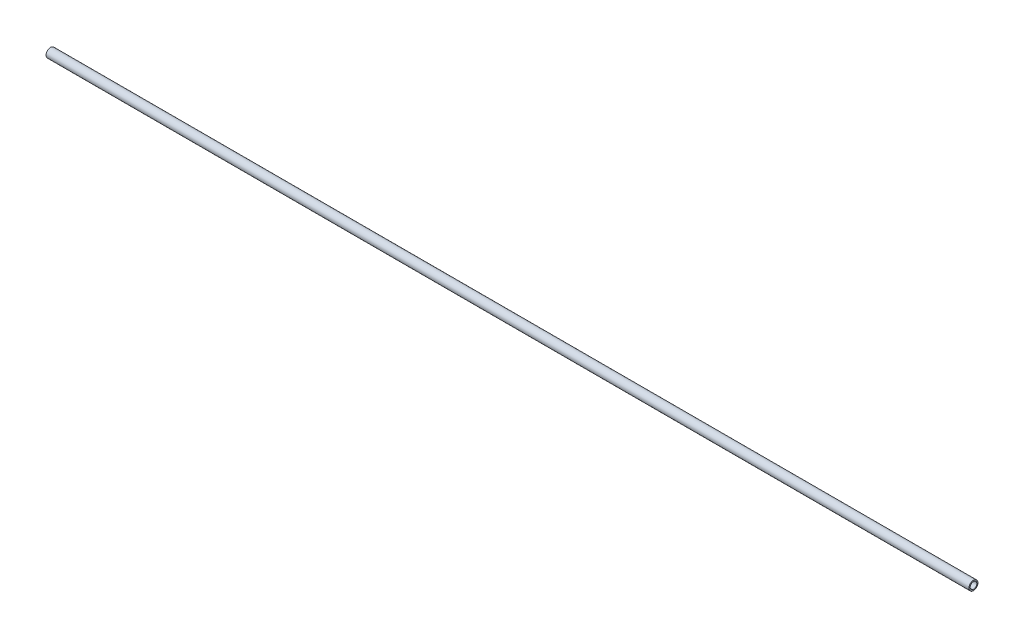
ISO-10303-21;
HEADER;
FILE_DESCRIPTION(('STEP AP214'),'2;1');
FILE_NAME('part.step','',(''),(''),'','','');
FILE_SCHEMA(('AUTOMOTIVE_DESIGN { 1 0 10303 214 1 1 1 1 }'));
ENDSEC;
DATA;
#1=APPLICATION_CONTEXT('core data for automotive mechanical design processes');
#2=APPLICATION_PROTOCOL_DEFINITION('international standard','automotive_design',2000,#1);
#3=PRODUCT_CONTEXT('',#1,'mechanical');
#4=PRODUCT('Part','Part','',(#3));
#5=PRODUCT_RELATED_PRODUCT_CATEGORY('part','',(#4));
#6=PRODUCT_DEFINITION_FORMATION('','',#4);
#7=PRODUCT_DEFINITION_CONTEXT('part definition',#1,'design');
#8=PRODUCT_DEFINITION('design','',#6,#7);
#9=PRODUCT_DEFINITION_SHAPE('','',#8);
#10=(LENGTH_UNIT() NAMED_UNIT(*) SI_UNIT(.MILLI.,.METRE.));
#11=(NAMED_UNIT(*) PLANE_ANGLE_UNIT() SI_UNIT($,.RADIAN.));
#12=(NAMED_UNIT(*) SI_UNIT($,.STERADIAN.) SOLID_ANGLE_UNIT());
#13=UNCERTAINTY_MEASURE_WITH_UNIT(LENGTH_MEASURE(1.E-05),#10,'distance_accuracy_value','');
#14=(GEOMETRIC_REPRESENTATION_CONTEXT(3) GLOBAL_UNCERTAINTY_ASSIGNED_CONTEXT((#13)) GLOBAL_UNIT_ASSIGNED_CONTEXT((#10,
#11,#12)) REPRESENTATION_CONTEXT('',''));
#15=CARTESIAN_POINT('',(0.,0.,0.));
#16=DIRECTION('',(0.,0.,1.));
#17=DIRECTION('',(1.,0.,0.));
#18=AXIS2_PLACEMENT_3D('',#15,#16,#17);
#19=CARTESIAN_POINT('',(974.852,0.,0.));
#20=DIRECTION('',(1.,0.,0.));
#21=DIRECTION('',(0.,0.,-1.));
#22=AXIS2_PLACEMENT_3D('',#19,#20,#21);
#23=PLANE('',#22);
#24=CARTESIAN_POINT('',(974.852,0.,0.));
#25=DIRECTION('',(1.,0.,0.));
#26=DIRECTION('',(0.,0.,-1.));
#27=AXIS2_PLACEMENT_3D('',#24,#25,#26);
#28=CIRCLE('',#27,4.7625);
#29=CARTESIAN_POINT('',(974.852,0.,-4.7625));
#30=VERTEX_POINT('',#29);
#31=EDGE_CURVE('E10',#30,#30,#28,.T.);
#32=ORIENTED_EDGE('',*,*,#31,.T.);
#33=EDGE_LOOP('',(#32));
#34=FACE_BOUND('',#33,.T.);
#35=CARTESIAN_POINT('',(974.852,0.,0.));
#36=DIRECTION('',(1.,0.,0.));
#37=DIRECTION('',(0.,0.,-1.));
#38=AXIS2_PLACEMENT_3D('',#35,#36,#37);
#39=CIRCLE('',#38,3.5179);
#40=CARTESIAN_POINT('',(974.852,0.,-3.5179));
#41=VERTEX_POINT('',#40);
#42=EDGE_CURVE('E56',#41,#41,#39,.T.);
#43=ORIENTED_EDGE('',*,*,#42,.F.);
#44=EDGE_LOOP('',(#43));
#45=FACE_BOUND('',#44,.T.);
#46=ADVANCED_FACE('F43',(#34,#45),#23,.T.);
#47=CARTESIAN_POINT('',(0.,0.,0.));
#48=DIRECTION('',(1.,0.,0.));
#49=DIRECTION('',(0.,0.,-1.));
#50=AXIS2_PLACEMENT_3D('',#47,#48,#49);
#51=PLANE('',#50);
#52=CARTESIAN_POINT('',(0.,0.,0.));
#53=DIRECTION('',(1.,0.,0.));
#54=DIRECTION('',(0.,0.,-1.));
#55=AXIS2_PLACEMENT_3D('',#52,#53,#54);
#56=CIRCLE('',#55,4.7625);
#57=CARTESIAN_POINT('',(0.,0.,-4.7625));
#58=VERTEX_POINT('',#57);
#59=EDGE_CURVE('E47',#58,#58,#56,.T.);
#60=ORIENTED_EDGE('',*,*,#59,.F.);
#61=EDGE_LOOP('',(#60));
#62=FACE_BOUND('',#61,.T.);
#63=CARTESIAN_POINT('',(0.,0.,0.));
#64=DIRECTION('',(1.,0.,0.));
#65=DIRECTION('',(0.,0.,-1.));
#66=AXIS2_PLACEMENT_3D('',#63,#64,#65);
#67=CIRCLE('',#66,3.5179);
#68=CARTESIAN_POINT('',(0.,0.,-3.5179));
#69=VERTEX_POINT('',#68);
#70=EDGE_CURVE('E58',#69,#69,#67,.T.);
#71=ORIENTED_EDGE('',*,*,#70,.T.);
#72=EDGE_LOOP('',(#71));
#73=FACE_BOUND('',#72,.T.);
#74=ADVANCED_FACE('F70',(#62,#73),#51,.F.);
#75=CARTESIAN_POINT('',(974.852,0.,0.));
#76=DIRECTION('',(-1.,0.,0.));
#77=DIRECTION('',(0.,0.,1.));
#78=AXIS2_PLACEMENT_3D('',#75,#76,#77);
#79=CYLINDRICAL_SURFACE('',#78,4.7625);
#80=ORIENTED_EDGE('',*,*,#31,.F.);
#81=EDGE_LOOP('',(#80));
#82=FACE_BOUND('',#81,.T.);
#83=ORIENTED_EDGE('',*,*,#59,.T.);
#84=EDGE_LOOP('',(#83));
#85=FACE_BOUND('',#84,.T.);
#86=ADVANCED_FACE('F45',(#82,#85),#79,.T.);
#87=CARTESIAN_POINT('',(974.852,0.,0.));
#88=DIRECTION('',(-1.,0.,0.));
#89=DIRECTION('',(0.,0.,1.));
#90=AXIS2_PLACEMENT_3D('',#87,#88,#89);
#91=CYLINDRICAL_SURFACE('',#90,3.5179);
#92=ORIENTED_EDGE('',*,*,#42,.T.);
#93=EDGE_LOOP('',(#92));
#94=FACE_BOUND('',#93,.T.);
#95=ORIENTED_EDGE('',*,*,#70,.F.);
#96=EDGE_LOOP('',(#95));
#97=FACE_BOUND('',#96,.T.);
#98=ADVANCED_FACE('F66',(#94,#97),#91,.F.);
#99=CLOSED_SHELL('',(#46,#74,#86,#98));
#100=MANIFOLD_SOLID_BREP('B2',#99);
#101=ADVANCED_BREP_SHAPE_REPRESENTATION('',(#18,#100),#14);
#102=SHAPE_DEFINITION_REPRESENTATION(#9,#101);
ENDSEC;
END-ISO-10303-21;
